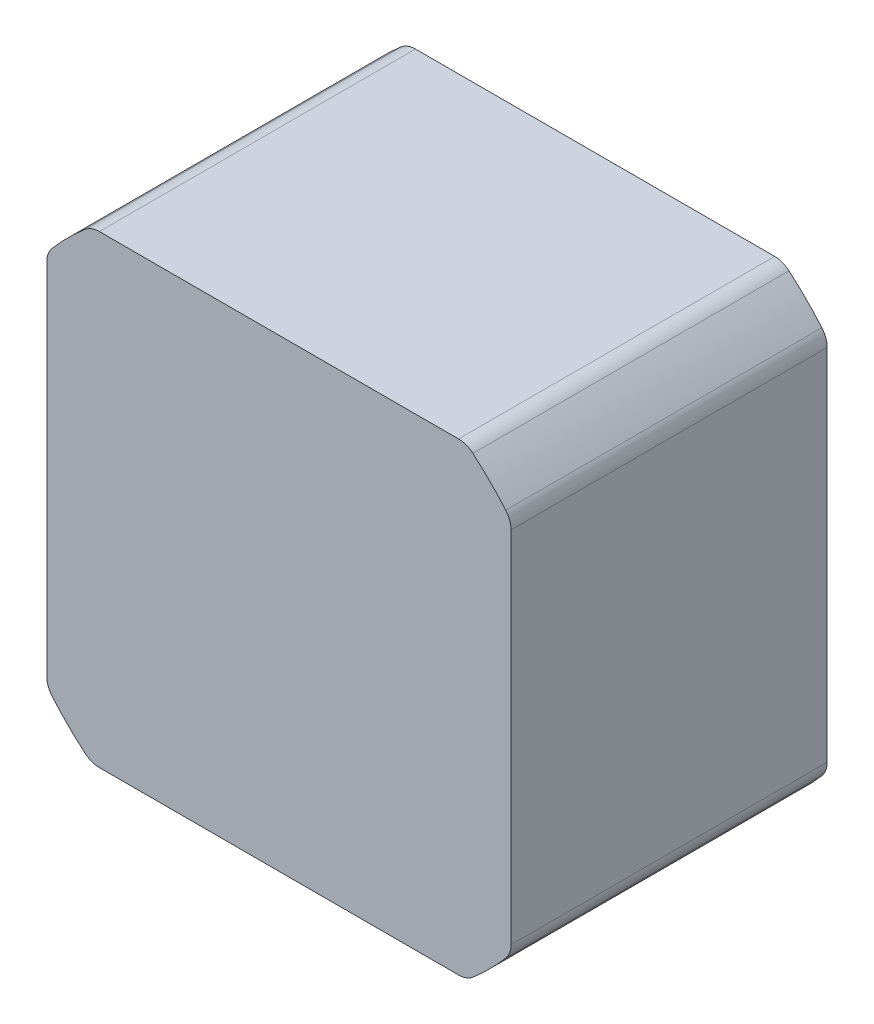
ISO-10303-21;
HEADER;
FILE_DESCRIPTION(('STEP AP214'),'2;1');
FILE_NAME('part.step','',(''),(''),'','','');
FILE_SCHEMA(('AUTOMOTIVE_DESIGN { 1 0 10303 214 1 1 1 1 }'));
ENDSEC;
DATA;
#1=APPLICATION_CONTEXT('core data for automotive mechanical design processes');
#2=APPLICATION_PROTOCOL_DEFINITION('international standard','automotive_design',2000,#1);
#3=PRODUCT_CONTEXT('',#1,'mechanical');
#4=PRODUCT('Part','Part','',(#3));
#5=PRODUCT_RELATED_PRODUCT_CATEGORY('part','',(#4));
#6=PRODUCT_DEFINITION_FORMATION('','',#4);
#7=PRODUCT_DEFINITION_CONTEXT('part definition',#1,'design');
#8=PRODUCT_DEFINITION('design','',#6,#7);
#9=PRODUCT_DEFINITION_SHAPE('','',#8);
#10=(LENGTH_UNIT() NAMED_UNIT(*) SI_UNIT(.MILLI.,.METRE.));
#11=(NAMED_UNIT(*) PLANE_ANGLE_UNIT() SI_UNIT($,.RADIAN.));
#12=(NAMED_UNIT(*) SI_UNIT($,.STERADIAN.) SOLID_ANGLE_UNIT());
#13=UNCERTAINTY_MEASURE_WITH_UNIT(LENGTH_MEASURE(1.E-05),#10,'distance_accuracy_value','');
#14=(GEOMETRIC_REPRESENTATION_CONTEXT(3) GLOBAL_UNCERTAINTY_ASSIGNED_CONTEXT((#13)) GLOBAL_UNIT_ASSIGNED_CONTEXT((#10,
#11,#12)) REPRESENTATION_CONTEXT('',''));
#15=CARTESIAN_POINT('',(0.,0.,0.));
#16=DIRECTION('',(0.,0.,1.));
#17=DIRECTION('',(1.,0.,0.));
#18=AXIS2_PLACEMENT_3D('',#15,#16,#17);
#19=CARTESIAN_POINT('',(0.,0.,8.7));
#20=DIRECTION('',(0.,0.,1.));
#21=DIRECTION('',(1.,0.,0.));
#22=AXIS2_PLACEMENT_3D('',#19,#20,#21);
#23=PLANE('',#22);
#24=CARTESIAN_POINT('',(0.,0.,8.7));
#25=DIRECTION('',(0.,0.,1.));
#26=DIRECTION('',(1.,0.,0.));
#27=AXIS2_PLACEMENT_3D('',#24,#25,#26);
#28=CIRCLE('',#27,27.);
#29=CARTESIAN_POINT('',(17.5479229540137,-20.52,8.7));
#30=VERTEX_POINT('',#29);
#31=CARTESIAN_POINT('',(20.52,-17.5479229540137,8.7));
#32=VERTEX_POINT('',#31);
#33=EDGE_CURVE('E317',#30,#32,#28,.T.);
#34=ORIENTED_EDGE('',*,*,#33,.F.);
#35=CARTESIAN_POINT('',(16.2480768092719,-19.,8.7));
#36=DIRECTION('',(0.,0.,1.));
#37=DIRECTION('',(1.,0.,0.));
#38=AXIS2_PLACEMENT_3D('',#35,#36,#37);
#39=CIRCLE('',#38,2.);
#40=CARTESIAN_POINT('',(16.2480768092719,-21.,8.7));
#41=VERTEX_POINT('',#40);
#42=EDGE_CURVE('E25',#41,#30,#39,.T.);
#43=ORIENTED_EDGE('',*,*,#42,.F.);
#44=DIRECTION('',(1.,0.,0.));
#45=VECTOR('',#44,1.);
#46=CARTESIAN_POINT('',(-16.2480768092719,-21.,8.7));
#47=LINE('',#46,#45);
#48=CARTESIAN_POINT('',(-16.2480768092719,-21.,8.7));
#49=VERTEX_POINT('',#48);
#50=EDGE_CURVE('E125',#49,#41,#47,.T.);
#51=ORIENTED_EDGE('',*,*,#50,.F.);
#52=CARTESIAN_POINT('',(-16.2480768092719,-19.,8.7));
#53=DIRECTION('',(0.,0.,1.));
#54=DIRECTION('',(1.,0.,0.));
#55=AXIS2_PLACEMENT_3D('',#52,#53,#54);
#56=CIRCLE('',#55,2.);
#57=CARTESIAN_POINT('',(-17.5479229540137,-20.52,8.7));
#58=VERTEX_POINT('',#57);
#59=EDGE_CURVE('E128',#58,#49,#56,.T.);
#60=ORIENTED_EDGE('',*,*,#59,.F.);
#61=CARTESIAN_POINT('',(0.,0.,8.7));
#62=DIRECTION('',(0.,0.,1.));
#63=DIRECTION('',(1.,0.,0.));
#64=AXIS2_PLACEMENT_3D('',#61,#62,#63);
#65=CIRCLE('',#64,27.);
#66=CARTESIAN_POINT('',(-20.52,-17.5479229540137,8.7));
#67=VERTEX_POINT('',#66);
#68=EDGE_CURVE('E292',#67,#58,#65,.T.);
#69=ORIENTED_EDGE('',*,*,#68,.F.);
#70=CARTESIAN_POINT('',(-19.,-16.248076809272,8.7));
#71=DIRECTION('',(0.,0.,1.));
#72=DIRECTION('',(1.,0.,0.));
#73=AXIS2_PLACEMENT_3D('',#70,#71,#72);
#74=CIRCLE('',#73,2.);
#75=CARTESIAN_POINT('',(-21.,-16.248076809272,8.7));
#76=VERTEX_POINT('',#75);
#77=EDGE_CURVE('E280',#76,#67,#74,.T.);
#78=ORIENTED_EDGE('',*,*,#77,.F.);
#79=DIRECTION('',(0.,-1.,0.));
#80=VECTOR('',#79,1.);
#81=CARTESIAN_POINT('',(-21.,16.248076809272,8.7));
#82=LINE('',#81,#80);
#83=CARTESIAN_POINT('',(-21.,16.248076809272,8.7));
#84=VERTEX_POINT('',#83);
#85=EDGE_CURVE('E266',#84,#76,#82,.T.);
#86=ORIENTED_EDGE('',*,*,#85,.F.);
#87=CARTESIAN_POINT('',(-19.,16.248076809272,8.7));
#88=DIRECTION('',(0.,0.,1.));
#89=DIRECTION('',(1.,0.,0.));
#90=AXIS2_PLACEMENT_3D('',#87,#88,#89);
#91=CIRCLE('',#90,2.);
#92=CARTESIAN_POINT('',(-20.52,17.5479229540137,8.7));
#93=VERTEX_POINT('',#92);
#94=EDGE_CURVE('E254',#93,#84,#91,.T.);
#95=ORIENTED_EDGE('',*,*,#94,.F.);
#96=CARTESIAN_POINT('',(0.,0.,8.7));
#97=DIRECTION('',(0.,0.,1.));
#98=DIRECTION('',(1.,0.,0.));
#99=AXIS2_PLACEMENT_3D('',#96,#97,#98);
#100=CIRCLE('',#99,27.);
#101=CARTESIAN_POINT('',(-17.5479229540137,20.52,8.7));
#102=VERTEX_POINT('',#101);
#103=EDGE_CURVE('E242',#102,#93,#100,.T.);
#104=ORIENTED_EDGE('',*,*,#103,.F.);
#105=CARTESIAN_POINT('',(-16.2480768092719,19.,8.7));
#106=DIRECTION('',(0.,0.,1.));
#107=DIRECTION('',(1.,0.,0.));
#108=AXIS2_PLACEMENT_3D('',#105,#106,#107);
#109=CIRCLE('',#108,2.);
#110=CARTESIAN_POINT('',(-16.2480768092719,21.,8.7));
#111=VERTEX_POINT('',#110);
#112=EDGE_CURVE('E230',#111,#102,#109,.T.);
#113=ORIENTED_EDGE('',*,*,#112,.F.);
#114=DIRECTION('',(-1.,0.,0.));
#115=VECTOR('',#114,1.);
#116=CARTESIAN_POINT('',(16.2480768092719,21.,8.7));
#117=LINE('',#116,#115);
#118=CARTESIAN_POINT('',(16.2480768092719,21.,8.7));
#119=VERTEX_POINT('',#118);
#120=EDGE_CURVE('E218',#119,#111,#117,.T.);
#121=ORIENTED_EDGE('',*,*,#120,.F.);
#122=CARTESIAN_POINT('',(16.2480768092719,19.,8.7));
#123=DIRECTION('',(0.,0.,1.));
#124=DIRECTION('',(1.,0.,0.));
#125=AXIS2_PLACEMENT_3D('',#122,#123,#124);
#126=CIRCLE('',#125,2.);
#127=CARTESIAN_POINT('',(17.5479229540137,20.52,8.7));
#128=VERTEX_POINT('',#127);
#129=EDGE_CURVE('E206',#128,#119,#126,.T.);
#130=ORIENTED_EDGE('',*,*,#129,.F.);
#131=CARTESIAN_POINT('',(0.,0.,8.7));
#132=DIRECTION('',(0.,0.,1.));
#133=DIRECTION('',(1.,0.,0.));
#134=AXIS2_PLACEMENT_3D('',#131,#132,#133);
#135=CIRCLE('',#134,27.);
#136=CARTESIAN_POINT('',(20.52,17.5479229540137,8.7));
#137=VERTEX_POINT('',#136);
#138=EDGE_CURVE('E165',#137,#128,#135,.T.);
#139=ORIENTED_EDGE('',*,*,#138,.F.);
#140=CARTESIAN_POINT('',(19.,16.248076809272,8.7));
#141=DIRECTION('',(0.,0.,1.));
#142=DIRECTION('',(1.,0.,0.));
#143=AXIS2_PLACEMENT_3D('',#140,#141,#142);
#144=CIRCLE('',#143,2.);
#145=CARTESIAN_POINT('',(21.,16.248076809272,8.7));
#146=VERTEX_POINT('',#145);
#147=EDGE_CURVE('E194',#146,#137,#144,.T.);
#148=ORIENTED_EDGE('',*,*,#147,.F.);
#149=DIRECTION('',(0.,1.,0.));
#150=VECTOR('',#149,1.);
#151=CARTESIAN_POINT('',(21.,-16.248076809272,8.7));
#152=LINE('',#151,#150);
#153=CARTESIAN_POINT('',(21.,-16.248076809272,8.7));
#154=VERTEX_POINT('',#153);
#155=EDGE_CURVE('E182',#154,#146,#152,.T.);
#156=ORIENTED_EDGE('',*,*,#155,.F.);
#157=CARTESIAN_POINT('',(19.,-16.248076809272,8.7));
#158=DIRECTION('',(0.,0.,1.));
#159=DIRECTION('',(1.,0.,0.));
#160=AXIS2_PLACEMENT_3D('',#157,#158,#159);
#161=CIRCLE('',#160,2.);
#162=EDGE_CURVE('E170',#32,#154,#161,.T.);
#163=ORIENTED_EDGE('',*,*,#162,.F.);
#164=EDGE_LOOP('',(#34,#43,#51,#60,#69,#78,#86,#95,#104,#113,#121,#130,#139,#148,#156,#163));
#165=FACE_BOUND('',#164,.T.);
#166=ADVANCED_FACE('F17',(#165),#23,.F.);
#167=CARTESIAN_POINT('',(0.,0.,37.3));
#168=DIRECTION('',(0.,0.,1.));
#169=DIRECTION('',(1.,0.,0.));
#170=AXIS2_PLACEMENT_3D('',#167,#168,#169);
#171=PLANE('',#170);
#172=CARTESIAN_POINT('',(0.,0.,37.3));
#173=DIRECTION('',(0.,0.,1.));
#174=DIRECTION('',(1.,0.,0.));
#175=AXIS2_PLACEMENT_3D('',#172,#173,#174);
#176=CIRCLE('',#175,27.);
#177=CARTESIAN_POINT('',(17.5479229540137,-20.52,37.3));
#178=VERTEX_POINT('',#177);
#179=CARTESIAN_POINT('',(20.52,-17.5479229540137,37.3));
#180=VERTEX_POINT('',#179);
#181=EDGE_CURVE('E159',#178,#180,#176,.T.);
#182=ORIENTED_EDGE('',*,*,#181,.T.);
#183=CARTESIAN_POINT('',(19.,-16.248076809272,37.3));
#184=DIRECTION('',(0.,0.,1.));
#185=DIRECTION('',(1.,0.,0.));
#186=AXIS2_PLACEMENT_3D('',#183,#184,#185);
#187=CIRCLE('',#186,2.);
#188=CARTESIAN_POINT('',(21.,-16.248076809272,37.3));
#189=VERTEX_POINT('',#188);
#190=EDGE_CURVE('E178',#180,#189,#187,.T.);
#191=ORIENTED_EDGE('',*,*,#190,.T.);
#192=DIRECTION('',(0.,1.,0.));
#193=VECTOR('',#192,1.);
#194=CARTESIAN_POINT('',(21.,-16.248076809272,37.3));
#195=LINE('',#194,#193);
#196=CARTESIAN_POINT('',(21.,16.248076809272,37.3));
#197=VERTEX_POINT('',#196);
#198=EDGE_CURVE('E190',#189,#197,#195,.T.);
#199=ORIENTED_EDGE('',*,*,#198,.T.);
#200=CARTESIAN_POINT('',(19.,16.248076809272,37.3));
#201=DIRECTION('',(0.,0.,1.));
#202=DIRECTION('',(1.,0.,0.));
#203=AXIS2_PLACEMENT_3D('',#200,#201,#202);
#204=CIRCLE('',#203,2.);
#205=CARTESIAN_POINT('',(20.52,17.5479229540137,37.3));
#206=VERTEX_POINT('',#205);
#207=EDGE_CURVE('E199',#197,#206,#204,.T.);
#208=ORIENTED_EDGE('',*,*,#207,.T.);
#209=CARTESIAN_POINT('',(0.,0.,37.3));
#210=DIRECTION('',(0.,0.,1.));
#211=DIRECTION('',(1.,0.,0.));
#212=AXIS2_PLACEMENT_3D('',#209,#210,#211);
#213=CIRCLE('',#212,27.);
#214=CARTESIAN_POINT('',(17.5479229540137,20.52,37.3));
#215=VERTEX_POINT('',#214);
#216=EDGE_CURVE('E164',#206,#215,#213,.T.);
#217=ORIENTED_EDGE('',*,*,#216,.T.);
#218=CARTESIAN_POINT('',(16.2480768092719,19.,37.3));
#219=DIRECTION('',(0.,0.,1.));
#220=DIRECTION('',(1.,0.,0.));
#221=AXIS2_PLACEMENT_3D('',#218,#219,#220);
#222=CIRCLE('',#221,2.);
#223=CARTESIAN_POINT('',(16.2480768092719,21.,37.3));
#224=VERTEX_POINT('',#223);
#225=EDGE_CURVE('E214',#215,#224,#222,.T.);
#226=ORIENTED_EDGE('',*,*,#225,.T.);
#227=DIRECTION('',(-1.,0.,0.));
#228=VECTOR('',#227,1.);
#229=CARTESIAN_POINT('',(16.2480768092719,21.,37.3));
#230=LINE('',#229,#228);
#231=CARTESIAN_POINT('',(-16.2480768092719,21.,37.3));
#232=VERTEX_POINT('',#231);
#233=EDGE_CURVE('E226',#224,#232,#230,.T.);
#234=ORIENTED_EDGE('',*,*,#233,.T.);
#235=CARTESIAN_POINT('',(-16.2480768092719,19.,37.3));
#236=DIRECTION('',(0.,0.,1.));
#237=DIRECTION('',(1.,0.,0.));
#238=AXIS2_PLACEMENT_3D('',#235,#236,#237);
#239=CIRCLE('',#238,2.);
#240=CARTESIAN_POINT('',(-17.5479229540137,20.52,37.3));
#241=VERTEX_POINT('',#240);
#242=EDGE_CURVE('E238',#232,#241,#239,.T.);
#243=ORIENTED_EDGE('',*,*,#242,.T.);
#244=CARTESIAN_POINT('',(0.,0.,37.3));
#245=DIRECTION('',(0.,0.,1.));
#246=DIRECTION('',(1.,0.,0.));
#247=AXIS2_PLACEMENT_3D('',#244,#245,#246);
#248=CIRCLE('',#247,27.);
#249=CARTESIAN_POINT('',(-20.52,17.5479229540137,37.3));
#250=VERTEX_POINT('',#249);
#251=EDGE_CURVE('E250',#241,#250,#248,.T.);
#252=ORIENTED_EDGE('',*,*,#251,.T.);
#253=CARTESIAN_POINT('',(-19.,16.248076809272,37.3));
#254=DIRECTION('',(0.,0.,1.));
#255=DIRECTION('',(1.,0.,0.));
#256=AXIS2_PLACEMENT_3D('',#253,#254,#255);
#257=CIRCLE('',#256,2.);
#258=CARTESIAN_POINT('',(-21.,16.248076809272,37.3));
#259=VERTEX_POINT('',#258);
#260=EDGE_CURVE('E262',#250,#259,#257,.T.);
#261=ORIENTED_EDGE('',*,*,#260,.T.);
#262=DIRECTION('',(0.,-1.,0.));
#263=VECTOR('',#262,1.);
#264=CARTESIAN_POINT('',(-21.,16.248076809272,37.3));
#265=LINE('',#264,#263);
#266=CARTESIAN_POINT('',(-21.,-16.248076809272,37.3));
#267=VERTEX_POINT('',#266);
#268=EDGE_CURVE('E274',#259,#267,#265,.T.);
#269=ORIENTED_EDGE('',*,*,#268,.T.);
#270=CARTESIAN_POINT('',(-19.,-16.248076809272,37.3));
#271=DIRECTION('',(0.,0.,1.));
#272=DIRECTION('',(1.,0.,0.));
#273=AXIS2_PLACEMENT_3D('',#270,#271,#272);
#274=CIRCLE('',#273,2.);
#275=CARTESIAN_POINT('',(-20.52,-17.5479229540137,37.3));
#276=VERTEX_POINT('',#275);
#277=EDGE_CURVE('E288',#267,#276,#274,.T.);
#278=ORIENTED_EDGE('',*,*,#277,.T.);
#279=CARTESIAN_POINT('',(0.,0.,37.3));
#280=DIRECTION('',(0.,0.,1.));
#281=DIRECTION('',(1.,0.,0.));
#282=AXIS2_PLACEMENT_3D('',#279,#280,#281);
#283=CIRCLE('',#282,27.);
#284=CARTESIAN_POINT('',(-17.5479229540137,-20.52,37.3));
#285=VERTEX_POINT('',#284);
#286=EDGE_CURVE('E149',#276,#285,#283,.T.);
#287=ORIENTED_EDGE('',*,*,#286,.T.);
#288=CARTESIAN_POINT('',(-16.2480768092719,-19.,37.3));
#289=DIRECTION('',(0.,0.,1.));
#290=DIRECTION('',(1.,0.,0.));
#291=AXIS2_PLACEMENT_3D('',#288,#289,#290);
#292=CIRCLE('',#291,2.);
#293=CARTESIAN_POINT('',(-16.2480768092719,-21.,37.3));
#294=VERTEX_POINT('',#293);
#295=EDGE_CURVE('E134',#285,#294,#292,.T.);
#296=ORIENTED_EDGE('',*,*,#295,.T.);
#297=DIRECTION('',(1.,0.,0.));
#298=VECTOR('',#297,1.);
#299=CARTESIAN_POINT('',(-16.2480768092719,-21.,37.3));
#300=LINE('',#299,#298);
#301=CARTESIAN_POINT('',(16.2480768092719,-21.,37.3));
#302=VERTEX_POINT('',#301);
#303=EDGE_CURVE('E139',#294,#302,#300,.T.);
#304=ORIENTED_EDGE('',*,*,#303,.T.);
#305=CARTESIAN_POINT('',(16.2480768092719,-19.,37.3));
#306=DIRECTION('',(0.,0.,1.));
#307=DIRECTION('',(1.,0.,0.));
#308=AXIS2_PLACEMENT_3D('',#305,#306,#307);
#309=CIRCLE('',#308,2.);
#310=EDGE_CURVE('E11',#302,#178,#309,.T.);
#311=ORIENTED_EDGE('',*,*,#310,.T.);
#312=EDGE_LOOP('',(#182,#191,#199,#208,#217,#226,#234,#243,#252,#261,#269,#278,#287,#296,#304,#311));
#313=FACE_BOUND('',#312,.T.);
#314=ADVANCED_FACE('F305',(#313),#171,.T.);
#315=CARTESIAN_POINT('',(16.2480768092719,-19.,37.3));
#316=DIRECTION('',(0.,0.,-1.));
#317=DIRECTION('',(-1.,0.,0.));
#318=AXIS2_PLACEMENT_3D('',#315,#316,#317);
#319=CYLINDRICAL_SURFACE('',#318,2.);
#320=ORIENTED_EDGE('',*,*,#42,.T.);
#321=DIRECTION('',(0.,0.,-1.));
#322=VECTOR('',#321,1.);
#323=CARTESIAN_POINT('',(17.5479229540137,-20.52,37.3));
#324=LINE('',#323,#322);
#325=EDGE_CURVE('E166',#178,#30,#324,.T.);
#326=ORIENTED_EDGE('',*,*,#325,.F.);
#327=ORIENTED_EDGE('',*,*,#310,.F.);
#328=DIRECTION('',(0.,0.,-1.));
#329=VECTOR('',#328,1.);
#330=CARTESIAN_POINT('',(16.2480768092719,-21.,37.3));
#331=LINE('',#330,#329);
#332=EDGE_CURVE('E133',#302,#41,#331,.T.);
#333=ORIENTED_EDGE('',*,*,#332,.T.);
#334=EDGE_LOOP('',(#320,#326,#327,#333));
#335=FACE_BOUND('',#334,.T.);
#336=ADVANCED_FACE('F307',(#335),#319,.T.);
#337=CARTESIAN_POINT('',(-16.2480768092719,-21.,37.3));
#338=DIRECTION('',(0.,1.,0.));
#339=DIRECTION('',(1.,0.,0.));
#340=AXIS2_PLACEMENT_3D('',#337,#338,#339);
#341=PLANE('',#340);
#342=ORIENTED_EDGE('',*,*,#50,.T.);
#343=ORIENTED_EDGE('',*,*,#332,.F.);
#344=ORIENTED_EDGE('',*,*,#303,.F.);
#345=DIRECTION('',(0.,0.,-1.));
#346=VECTOR('',#345,1.);
#347=CARTESIAN_POINT('',(-16.2480768092719,-21.,37.3));
#348=LINE('',#347,#346);
#349=EDGE_CURVE('E137',#294,#49,#348,.T.);
#350=ORIENTED_EDGE('',*,*,#349,.T.);
#351=EDGE_LOOP('',(#342,#343,#344,#350));
#352=FACE_BOUND('',#351,.T.);
#353=ADVANCED_FACE('F138',(#352),#341,.F.);
#354=CARTESIAN_POINT('',(-16.2480768092719,-19.,37.3));
#355=DIRECTION('',(0.,0.,-1.));
#356=DIRECTION('',(-1.,0.,0.));
#357=AXIS2_PLACEMENT_3D('',#354,#355,#356);
#358=CYLINDRICAL_SURFACE('',#357,2.);
#359=ORIENTED_EDGE('',*,*,#59,.T.);
#360=ORIENTED_EDGE('',*,*,#349,.F.);
#361=ORIENTED_EDGE('',*,*,#295,.F.);
#362=DIRECTION('',(0.,0.,-1.));
#363=VECTOR('',#362,1.);
#364=CARTESIAN_POINT('',(-17.5479229540137,-20.52,37.3));
#365=LINE('',#364,#363);
#366=EDGE_CURVE('E146',#285,#58,#365,.T.);
#367=ORIENTED_EDGE('',*,*,#366,.T.);
#368=EDGE_LOOP('',(#359,#360,#361,#367));
#369=FACE_BOUND('',#368,.T.);
#370=ADVANCED_FACE('F144',(#369),#358,.T.);
#371=CARTESIAN_POINT('',(0.,0.,37.3));
#372=DIRECTION('',(0.,0.,-1.));
#373=DIRECTION('',(-1.,0.,0.));
#374=AXIS2_PLACEMENT_3D('',#371,#372,#373);
#375=CYLINDRICAL_SURFACE('',#374,27.);
#376=ORIENTED_EDGE('',*,*,#68,.T.);
#377=ORIENTED_EDGE('',*,*,#366,.F.);
#378=ORIENTED_EDGE('',*,*,#286,.F.);
#379=DIRECTION('',(0.,0.,-1.));
#380=VECTOR('',#379,1.);
#381=CARTESIAN_POINT('',(-20.52,-17.5479229540137,37.3));
#382=LINE('',#381,#380);
#383=EDGE_CURVE('E284',#276,#67,#382,.T.);
#384=ORIENTED_EDGE('',*,*,#383,.T.);
#385=EDGE_LOOP('',(#376,#377,#378,#384));
#386=FACE_BOUND('',#385,.T.);
#387=ADVANCED_FACE('F393',(#386),#375,.T.);
#388=CARTESIAN_POINT('',(-19.,-16.248076809272,37.3));
#389=DIRECTION('',(0.,0.,-1.));
#390=DIRECTION('',(-1.,0.,0.));
#391=AXIS2_PLACEMENT_3D('',#388,#389,#390);
#392=CYLINDRICAL_SURFACE('',#391,2.);
#393=ORIENTED_EDGE('',*,*,#77,.T.);
#394=ORIENTED_EDGE('',*,*,#383,.F.);
#395=ORIENTED_EDGE('',*,*,#277,.F.);
#396=DIRECTION('',(0.,0.,-1.));
#397=VECTOR('',#396,1.);
#398=CARTESIAN_POINT('',(-21.,-16.248076809272,37.3));
#399=LINE('',#398,#397);
#400=EDGE_CURVE('E270',#267,#76,#399,.T.);
#401=ORIENTED_EDGE('',*,*,#400,.T.);
#402=EDGE_LOOP('',(#393,#394,#395,#401));
#403=FACE_BOUND('',#402,.T.);
#404=ADVANCED_FACE('F391',(#403),#392,.T.);
#405=CARTESIAN_POINT('',(-21.,16.248076809272,37.3));
#406=DIRECTION('',(1.,0.,0.));
#407=DIRECTION('',(0.,1.,0.));
#408=AXIS2_PLACEMENT_3D('',#405,#406,#407);
#409=PLANE('',#408);
#410=ORIENTED_EDGE('',*,*,#85,.T.);
#411=ORIENTED_EDGE('',*,*,#400,.F.);
#412=ORIENTED_EDGE('',*,*,#268,.F.);
#413=DIRECTION('',(0.,0.,-1.));
#414=VECTOR('',#413,1.);
#415=CARTESIAN_POINT('',(-21.,16.248076809272,37.3));
#416=LINE('',#415,#414);
#417=EDGE_CURVE('E258',#259,#84,#416,.T.);
#418=ORIENTED_EDGE('',*,*,#417,.T.);
#419=EDGE_LOOP('',(#410,#411,#412,#418));
#420=FACE_BOUND('',#419,.T.);
#421=ADVANCED_FACE('F389',(#420),#409,.F.);
#422=CARTESIAN_POINT('',(-19.,16.248076809272,37.3));
#423=DIRECTION('',(0.,0.,-1.));
#424=DIRECTION('',(-1.,0.,0.));
#425=AXIS2_PLACEMENT_3D('',#422,#423,#424);
#426=CYLINDRICAL_SURFACE('',#425,2.);
#427=ORIENTED_EDGE('',*,*,#94,.T.);
#428=ORIENTED_EDGE('',*,*,#417,.F.);
#429=ORIENTED_EDGE('',*,*,#260,.F.);
#430=DIRECTION('',(0.,0.,-1.));
#431=VECTOR('',#430,1.);
#432=CARTESIAN_POINT('',(-20.52,17.5479229540137,37.3));
#433=LINE('',#432,#431);
#434=EDGE_CURVE('E246',#250,#93,#433,.T.);
#435=ORIENTED_EDGE('',*,*,#434,.T.);
#436=EDGE_LOOP('',(#427,#428,#429,#435));
#437=FACE_BOUND('',#436,.T.);
#438=ADVANCED_FACE('F384',(#437),#426,.T.);
#439=CARTESIAN_POINT('',(0.,0.,37.3));
#440=DIRECTION('',(0.,0.,-1.));
#441=DIRECTION('',(-1.,0.,0.));
#442=AXIS2_PLACEMENT_3D('',#439,#440,#441);
#443=CYLINDRICAL_SURFACE('',#442,27.);
#444=ORIENTED_EDGE('',*,*,#103,.T.);
#445=ORIENTED_EDGE('',*,*,#434,.F.);
#446=ORIENTED_EDGE('',*,*,#251,.F.);
#447=DIRECTION('',(0.,0.,-1.));
#448=VECTOR('',#447,1.);
#449=CARTESIAN_POINT('',(-17.5479229540137,20.52,37.3));
#450=LINE('',#449,#448);
#451=EDGE_CURVE('E234',#241,#102,#450,.T.);
#452=ORIENTED_EDGE('',*,*,#451,.T.);
#453=EDGE_LOOP('',(#444,#445,#446,#452));
#454=FACE_BOUND('',#453,.T.);
#455=ADVANCED_FACE('F382',(#454),#443,.T.);
#456=CARTESIAN_POINT('',(-16.2480768092719,19.,37.3));
#457=DIRECTION('',(0.,0.,-1.));
#458=DIRECTION('',(-1.,0.,0.));
#459=AXIS2_PLACEMENT_3D('',#456,#457,#458);
#460=CYLINDRICAL_SURFACE('',#459,2.);
#461=ORIENTED_EDGE('',*,*,#112,.T.);
#462=ORIENTED_EDGE('',*,*,#451,.F.);
#463=ORIENTED_EDGE('',*,*,#242,.F.);
#464=DIRECTION('',(0.,0.,-1.));
#465=VECTOR('',#464,1.);
#466=CARTESIAN_POINT('',(-16.2480768092719,21.,37.3));
#467=LINE('',#466,#465);
#468=EDGE_CURVE('E222',#232,#111,#467,.T.);
#469=ORIENTED_EDGE('',*,*,#468,.T.);
#470=EDGE_LOOP('',(#461,#462,#463,#469));
#471=FACE_BOUND('',#470,.T.);
#472=ADVANCED_FACE('F377',(#471),#460,.T.);
#473=CARTESIAN_POINT('',(16.2480768092719,21.,37.3));
#474=DIRECTION('',(0.,-1.,0.));
#475=DIRECTION('',(0.,0.,-1.));
#476=AXIS2_PLACEMENT_3D('',#473,#474,#475);
#477=PLANE('',#476);
#478=ORIENTED_EDGE('',*,*,#120,.T.);
#479=ORIENTED_EDGE('',*,*,#468,.F.);
#480=ORIENTED_EDGE('',*,*,#233,.F.);
#481=DIRECTION('',(0.,0.,-1.));
#482=VECTOR('',#481,1.);
#483=CARTESIAN_POINT('',(16.2480768092719,21.,37.3));
#484=LINE('',#483,#482);
#485=EDGE_CURVE('E210',#224,#119,#484,.T.);
#486=ORIENTED_EDGE('',*,*,#485,.T.);
#487=EDGE_LOOP('',(#478,#479,#480,#486));
#488=FACE_BOUND('',#487,.T.);
#489=ADVANCED_FACE('F379',(#488),#477,.F.);
#490=CARTESIAN_POINT('',(16.2480768092719,19.,37.3));
#491=DIRECTION('',(0.,0.,-1.));
#492=DIRECTION('',(-1.,0.,0.));
#493=AXIS2_PLACEMENT_3D('',#490,#491,#492);
#494=CYLINDRICAL_SURFACE('',#493,2.);
#495=ORIENTED_EDGE('',*,*,#129,.T.);
#496=ORIENTED_EDGE('',*,*,#485,.F.);
#497=ORIENTED_EDGE('',*,*,#225,.F.);
#498=DIRECTION('',(0.,0.,-1.));
#499=VECTOR('',#498,1.);
#500=CARTESIAN_POINT('',(17.5479229540137,20.52,37.3));
#501=LINE('',#500,#499);
#502=EDGE_CURVE('E161',#215,#128,#501,.T.);
#503=ORIENTED_EDGE('',*,*,#502,.T.);
#504=EDGE_LOOP('',(#495,#496,#497,#503));
#505=FACE_BOUND('',#504,.T.);
#506=ADVANCED_FACE('F348',(#505),#494,.T.);
#507=CARTESIAN_POINT('',(0.,0.,37.3));
#508=DIRECTION('',(0.,0.,-1.));
#509=DIRECTION('',(-1.,0.,0.));
#510=AXIS2_PLACEMENT_3D('',#507,#508,#509);
#511=CYLINDRICAL_SURFACE('',#510,27.);
#512=ORIENTED_EDGE('',*,*,#138,.T.);
#513=ORIENTED_EDGE('',*,*,#502,.F.);
#514=ORIENTED_EDGE('',*,*,#216,.F.);
#515=DIRECTION('',(0.,0.,-1.));
#516=VECTOR('',#515,1.);
#517=CARTESIAN_POINT('',(20.52,17.5479229540137,37.3));
#518=LINE('',#517,#516);
#519=EDGE_CURVE('E197',#206,#137,#518,.T.);
#520=ORIENTED_EDGE('',*,*,#519,.T.);
#521=EDGE_LOOP('',(#512,#513,#514,#520));
#522=FACE_BOUND('',#521,.T.);
#523=ADVANCED_FACE('F336',(#522),#511,.T.);
#524=CARTESIAN_POINT('',(19.,16.248076809272,37.3));
#525=DIRECTION('',(0.,0.,-1.));
#526=DIRECTION('',(-1.,0.,0.));
#527=AXIS2_PLACEMENT_3D('',#524,#525,#526);
#528=CYLINDRICAL_SURFACE('',#527,2.);
#529=ORIENTED_EDGE('',*,*,#147,.T.);
#530=ORIENTED_EDGE('',*,*,#519,.F.);
#531=ORIENTED_EDGE('',*,*,#207,.F.);
#532=DIRECTION('',(0.,0.,-1.));
#533=VECTOR('',#532,1.);
#534=CARTESIAN_POINT('',(21.,16.248076809272,37.3));
#535=LINE('',#534,#533);
#536=EDGE_CURVE('E186',#197,#146,#535,.T.);
#537=ORIENTED_EDGE('',*,*,#536,.T.);
#538=EDGE_LOOP('',(#529,#530,#531,#537));
#539=FACE_BOUND('',#538,.T.);
#540=ADVANCED_FACE('F470',(#539),#528,.T.);
#541=CARTESIAN_POINT('',(21.,-16.248076809272,37.3));
#542=DIRECTION('',(-1.,0.,0.));
#543=DIRECTION('',(0.,1.,0.));
#544=AXIS2_PLACEMENT_3D('',#541,#542,#543);
#545=PLANE('',#544);
#546=ORIENTED_EDGE('',*,*,#155,.T.);
#547=ORIENTED_EDGE('',*,*,#536,.F.);
#548=ORIENTED_EDGE('',*,*,#198,.F.);
#549=DIRECTION('',(0.,0.,-1.));
#550=VECTOR('',#549,1.);
#551=CARTESIAN_POINT('',(21.,-16.248076809272,37.3));
#552=LINE('',#551,#550);
#553=EDGE_CURVE('E174',#189,#154,#552,.T.);
#554=ORIENTED_EDGE('',*,*,#553,.T.);
#555=EDGE_LOOP('',(#546,#547,#548,#554));
#556=FACE_BOUND('',#555,.T.);
#557=ADVANCED_FACE('F477',(#556),#545,.F.);
#558=CARTESIAN_POINT('',(19.,-16.248076809272,37.3));
#559=DIRECTION('',(0.,0.,-1.));
#560=DIRECTION('',(-1.,0.,0.));
#561=AXIS2_PLACEMENT_3D('',#558,#559,#560);
#562=CYLINDRICAL_SURFACE('',#561,2.);
#563=ORIENTED_EDGE('',*,*,#162,.T.);
#564=ORIENTED_EDGE('',*,*,#553,.F.);
#565=ORIENTED_EDGE('',*,*,#190,.F.);
#566=DIRECTION('',(0.,0.,-1.));
#567=VECTOR('',#566,1.);
#568=CARTESIAN_POINT('',(20.52,-17.5479229540137,37.3));
#569=LINE('',#568,#567);
#570=EDGE_CURVE('E322',#180,#32,#569,.T.);
#571=ORIENTED_EDGE('',*,*,#570,.T.);
#572=EDGE_LOOP('',(#563,#564,#565,#571));
#573=FACE_BOUND('',#572,.T.);
#574=ADVANCED_FACE('F485',(#573),#562,.T.);
#575=CARTESIAN_POINT('',(0.,0.,37.3));
#576=DIRECTION('',(0.,0.,-1.));
#577=DIRECTION('',(-1.,0.,0.));
#578=AXIS2_PLACEMENT_3D('',#575,#576,#577);
#579=CYLINDRICAL_SURFACE('',#578,27.);
#580=ORIENTED_EDGE('',*,*,#33,.T.);
#581=ORIENTED_EDGE('',*,*,#570,.F.);
#582=ORIENTED_EDGE('',*,*,#181,.F.);
#583=ORIENTED_EDGE('',*,*,#325,.T.);
#584=EDGE_LOOP('',(#580,#581,#582,#583));
#585=FACE_BOUND('',#584,.T.);
#586=ADVANCED_FACE('F315',(#585),#579,.T.);
#587=CLOSED_SHELL('',(#166,#314,#336,#353,#370,#387,#404,#421,#438,#455,#472,#489,#506,#523,
#540,#557,#574,#586));
#588=MANIFOLD_SOLID_BREP('B1',#587);
#589=ADVANCED_BREP_SHAPE_REPRESENTATION('',(#18,#588),#14);
#590=SHAPE_DEFINITION_REPRESENTATION(#9,#589);
ENDSEC;
END-ISO-10303-21;
